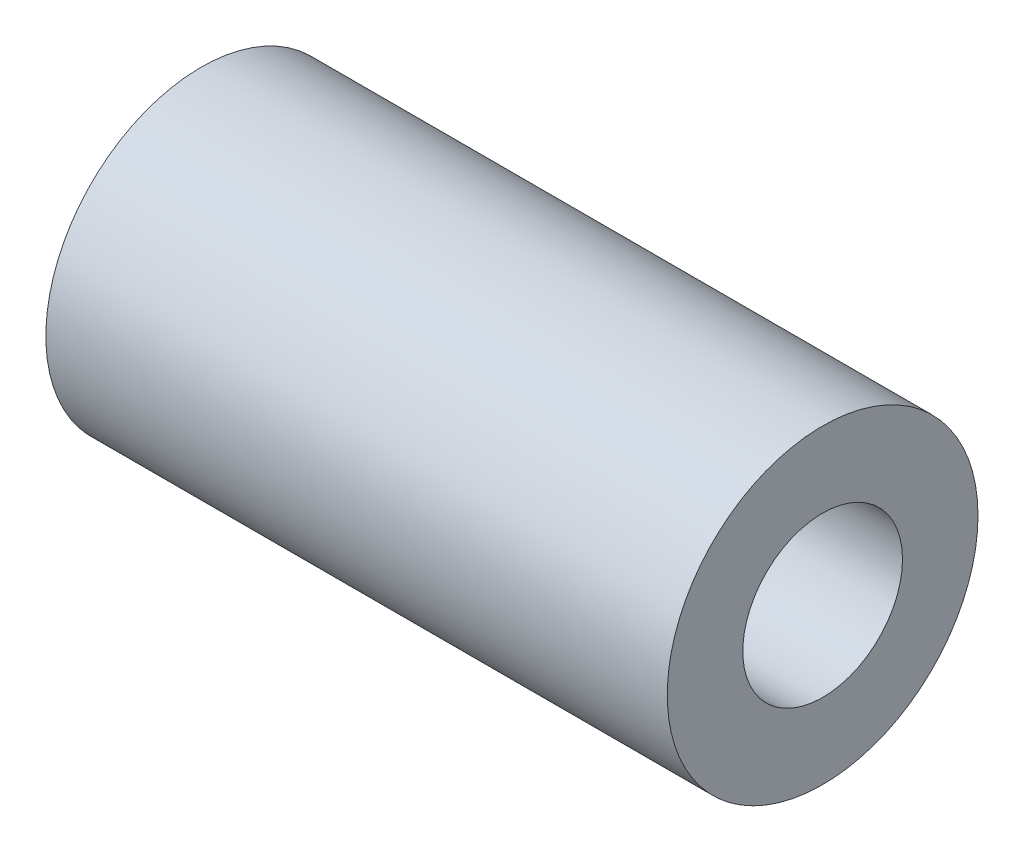
ISO-10303-21;
HEADER;
FILE_DESCRIPTION(('STEP AP214'),'2;1');
FILE_NAME('part.step','',(''),(''),'','','');
FILE_SCHEMA(('AUTOMOTIVE_DESIGN { 1 0 10303 214 1 1 1 1 }'));
ENDSEC;
DATA;
#1=APPLICATION_CONTEXT('core data for automotive mechanical design processes');
#2=APPLICATION_PROTOCOL_DEFINITION('international standard','automotive_design',2000,#1);
#3=PRODUCT_CONTEXT('',#1,'mechanical');
#4=PRODUCT('Part','Part','',(#3));
#5=PRODUCT_RELATED_PRODUCT_CATEGORY('part','',(#4));
#6=PRODUCT_DEFINITION_FORMATION('','',#4);
#7=PRODUCT_DEFINITION_CONTEXT('part definition',#1,'design');
#8=PRODUCT_DEFINITION('design','',#6,#7);
#9=PRODUCT_DEFINITION_SHAPE('','',#8);
#10=(LENGTH_UNIT() NAMED_UNIT(*) SI_UNIT(.MILLI.,.METRE.));
#11=(NAMED_UNIT(*) PLANE_ANGLE_UNIT() SI_UNIT($,.RADIAN.));
#12=(NAMED_UNIT(*) SI_UNIT($,.STERADIAN.) SOLID_ANGLE_UNIT());
#13=UNCERTAINTY_MEASURE_WITH_UNIT(LENGTH_MEASURE(1.E-05),#10,'distance_accuracy_value','');
#14=(GEOMETRIC_REPRESENTATION_CONTEXT(3) GLOBAL_UNCERTAINTY_ASSIGNED_CONTEXT((#13)) GLOBAL_UNIT_ASSIGNED_CONTEXT((#10,
#11,#12)) REPRESENTATION_CONTEXT('',''));
#15=CARTESIAN_POINT('',(0.,0.,0.));
#16=DIRECTION('',(0.,0.,1.));
#17=DIRECTION('',(1.,0.,0.));
#18=AXIS2_PLACEMENT_3D('',#15,#16,#17);
#19=CARTESIAN_POINT('',(25.4,0.,0.));
#20=DIRECTION('',(1.,0.,0.));
#21=DIRECTION('',(0.,0.,-1.));
#22=AXIS2_PLACEMENT_3D('',#19,#20,#21);
#23=PLANE('',#22);
#24=CARTESIAN_POINT('',(25.4,0.,0.));
#25=DIRECTION('',(1.,0.,0.));
#26=DIRECTION('',(0.,0.,-1.));
#27=AXIS2_PLACEMENT_3D('',#24,#25,#26);
#28=CIRCLE('',#27,6.35);
#29=CARTESIAN_POINT('',(25.4,0.,-6.35));
#30=VERTEX_POINT('',#29);
#31=EDGE_CURVE('E10',#30,#30,#28,.T.);
#32=ORIENTED_EDGE('',*,*,#31,.T.);
#33=EDGE_LOOP('',(#32));
#34=FACE_BOUND('',#33,.T.);
#35=CARTESIAN_POINT('',(25.4,0.,0.));
#36=DIRECTION('',(1.,0.,0.));
#37=DIRECTION('',(0.,0.,-1.));
#38=AXIS2_PLACEMENT_3D('',#35,#36,#37);
#39=CIRCLE('',#38,3.2639);
#40=CARTESIAN_POINT('',(25.4,0.,-3.2639));
#41=VERTEX_POINT('',#40);
#42=EDGE_CURVE('E44',#41,#41,#39,.T.);
#43=ORIENTED_EDGE('',*,*,#42,.F.);
#44=EDGE_LOOP('',(#43));
#45=FACE_BOUND('',#44,.T.);
#46=ADVANCED_FACE('F33',(#34,#45),#23,.T.);
#47=CARTESIAN_POINT('',(0.,0.,0.));
#48=DIRECTION('',(1.,0.,0.));
#49=DIRECTION('',(0.,0.,-1.));
#50=AXIS2_PLACEMENT_3D('',#47,#48,#49);
#51=PLANE('',#50);
#52=CARTESIAN_POINT('',(0.,0.,0.));
#53=DIRECTION('',(1.,0.,0.));
#54=DIRECTION('',(0.,0.,-1.));
#55=AXIS2_PLACEMENT_3D('',#52,#53,#54);
#56=CIRCLE('',#55,6.35);
#57=CARTESIAN_POINT('',(0.,0.,-6.35));
#58=VERTEX_POINT('',#57);
#59=EDGE_CURVE('E37',#58,#58,#56,.T.);
#60=ORIENTED_EDGE('',*,*,#59,.F.);
#61=EDGE_LOOP('',(#60));
#62=FACE_BOUND('',#61,.T.);
#63=CARTESIAN_POINT('',(0.,0.,0.));
#64=DIRECTION('',(1.,0.,0.));
#65=DIRECTION('',(0.,0.,-1.));
#66=AXIS2_PLACEMENT_3D('',#63,#64,#65);
#67=CIRCLE('',#66,3.2639);
#68=CARTESIAN_POINT('',(0.,0.,-3.2639));
#69=VERTEX_POINT('',#68);
#70=EDGE_CURVE('E46',#69,#69,#67,.T.);
#71=ORIENTED_EDGE('',*,*,#70,.T.);
#72=EDGE_LOOP('',(#71));
#73=FACE_BOUND('',#72,.T.);
#74=ADVANCED_FACE('F56',(#62,#73),#51,.F.);
#75=CARTESIAN_POINT('',(25.4,0.,0.));
#76=DIRECTION('',(-1.,0.,0.));
#77=DIRECTION('',(0.,0.,1.));
#78=AXIS2_PLACEMENT_3D('',#75,#76,#77);
#79=CYLINDRICAL_SURFACE('',#78,6.35);
#80=ORIENTED_EDGE('',*,*,#31,.F.);
#81=EDGE_LOOP('',(#80));
#82=FACE_BOUND('',#81,.T.);
#83=ORIENTED_EDGE('',*,*,#59,.T.);
#84=EDGE_LOOP('',(#83));
#85=FACE_BOUND('',#84,.T.);
#86=ADVANCED_FACE('F35',(#82,#85),#79,.T.);
#87=CARTESIAN_POINT('',(25.4,0.,0.));
#88=DIRECTION('',(-1.,0.,0.));
#89=DIRECTION('',(0.,0.,1.));
#90=AXIS2_PLACEMENT_3D('',#87,#88,#89);
#91=CYLINDRICAL_SURFACE('',#90,3.2639);
#92=ORIENTED_EDGE('',*,*,#42,.T.);
#93=EDGE_LOOP('',(#92));
#94=FACE_BOUND('',#93,.T.);
#95=ORIENTED_EDGE('',*,*,#70,.F.);
#96=EDGE_LOOP('',(#95));
#97=FACE_BOUND('',#96,.T.);
#98=ADVANCED_FACE('F52',(#94,#97),#91,.F.);
#99=CLOSED_SHELL('',(#46,#74,#86,#98));
#100=MANIFOLD_SOLID_BREP('B2',#99);
#101=ADVANCED_BREP_SHAPE_REPRESENTATION('',(#18,#100),#14);
#102=SHAPE_DEFINITION_REPRESENTATION(#9,#101);
ENDSEC;
END-ISO-10303-21;
